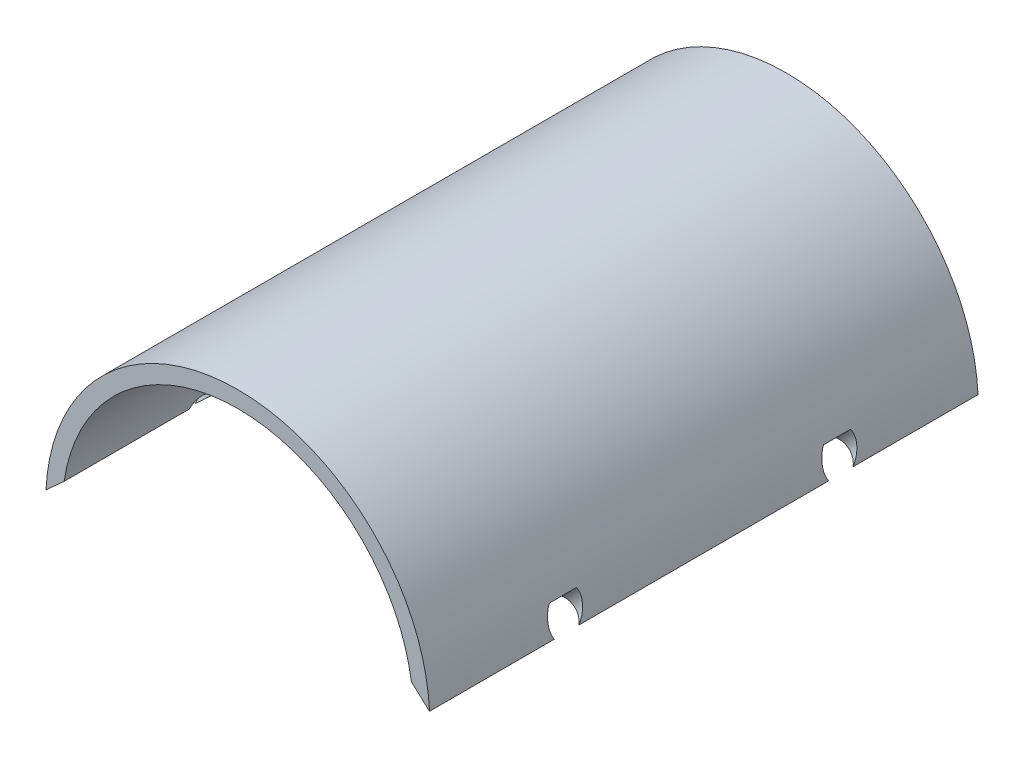
ISO-10303-21;
HEADER;
FILE_DESCRIPTION(('STEP AP214'),'2;1');
FILE_NAME('part.step','',(''),(''),'','','');
FILE_SCHEMA(('AUTOMOTIVE_DESIGN { 1 0 10303 214 1 1 1 1 }'));
ENDSEC;
DATA;
#1=APPLICATION_CONTEXT('core data for automotive mechanical design processes');
#2=APPLICATION_PROTOCOL_DEFINITION('international standard','automotive_design',2000,#1);
#3=PRODUCT_CONTEXT('',#1,'mechanical');
#4=PRODUCT('Part','Part','',(#3));
#5=PRODUCT_RELATED_PRODUCT_CATEGORY('part','',(#4));
#6=PRODUCT_DEFINITION_FORMATION('','',#4);
#7=PRODUCT_DEFINITION_CONTEXT('part definition',#1,'design');
#8=PRODUCT_DEFINITION('design','',#6,#7);
#9=PRODUCT_DEFINITION_SHAPE('','',#8);
#10=(LENGTH_UNIT() NAMED_UNIT(*) SI_UNIT(.MILLI.,.METRE.));
#11=(NAMED_UNIT(*) PLANE_ANGLE_UNIT() SI_UNIT($,.RADIAN.));
#12=(NAMED_UNIT(*) SI_UNIT($,.STERADIAN.) SOLID_ANGLE_UNIT());
#13=UNCERTAINTY_MEASURE_WITH_UNIT(LENGTH_MEASURE(1.E-05),#10,'distance_accuracy_value','');
#14=(GEOMETRIC_REPRESENTATION_CONTEXT(3) GLOBAL_UNCERTAINTY_ASSIGNED_CONTEXT((#13)) GLOBAL_UNIT_ASSIGNED_CONTEXT((#10,
#11,#12)) REPRESENTATION_CONTEXT('',''));
#15=CARTESIAN_POINT('',(0.,0.,0.));
#16=DIRECTION('',(0.,0.,1.));
#17=DIRECTION('',(1.,0.,0.));
#18=AXIS2_PLACEMENT_3D('',#15,#16,#17);
#19=CARTESIAN_POINT('',(40.2038837694651,5.93778829627168,127.));
#20=DIRECTION('',(0.672307408747507,0.740272077106257,0.));
#21=DIRECTION('',(-0.740272077106257,0.672307408747507,0.));
#22=AXIS2_PLACEMENT_3D('',#19,#20,#21);
#23=PLANE('',#22);
#24=DIRECTION('',(0.,0.,-1.));
#25=VECTOR('',#24,1.);
#26=CARTESIAN_POINT('',(40.2038837694651,5.93778829627168,127.));
#27=LINE('',#26,#25);
#28=CARTESIAN_POINT('',(40.2038837694651,5.93778829627169,92.4266801787406));
#29=VERTEX_POINT('',#28);
#30=CARTESIAN_POINT('',(40.2038837694651,5.93778829627169,34.5733198212594));
#31=VERTEX_POINT('',#30);
#32=EDGE_CURVE('E175',#29,#31,#27,.T.);
#33=ORIENTED_EDGE('',*,*,#32,.T.);
#34=CARTESIAN_POINT('',(42.3014633715025,4.03278829627168,31.75));
#35=DIRECTION('',(-0.672307408747507,-0.740272077106257,0.));
#36=DIRECTION('',(-0.740272077106257,0.672307408747507,0.));
#37=AXIS2_PLACEMENT_3D('',#34,#35,#36);
#38=CIRCLE('',#37,4.);
#39=CARTESIAN_POINT('',(44.39904297354,2.12778829627169,34.5733198212594));
#40=VERTEX_POINT('',#39);
#41=EDGE_CURVE('E157',#40,#31,#38,.T.);
#42=ORIENTED_EDGE('',*,*,#41,.F.);
#43=DIRECTION('',(0.,0.,-1.));
#44=VECTOR('',#43,1.);
#45=CARTESIAN_POINT('',(44.39904297354,2.12778829627168,127.));
#46=LINE('',#45,#44);
#47=CARTESIAN_POINT('',(44.39904297354,2.12778829627169,92.4266801787406));
#48=VERTEX_POINT('',#47);
#49=EDGE_CURVE('E180',#48,#40,#46,.T.);
#50=ORIENTED_EDGE('',*,*,#49,.F.);
#51=CARTESIAN_POINT('',(42.3014633715025,4.03278829627168,95.25));
#52=DIRECTION('',(-0.672307408747507,-0.740272077106257,0.));
#53=DIRECTION('',(0.740272077106257,-0.672307408747507,0.));
#54=AXIS2_PLACEMENT_3D('',#51,#52,#53);
#55=CIRCLE('',#54,4.);
#56=EDGE_CURVE('E162',#29,#48,#55,.T.);
#57=ORIENTED_EDGE('',*,*,#56,.F.);
#58=EDGE_LOOP('',(#33,#42,#50,#57));
#59=FACE_BOUND('',#58,.T.);
#60=ADVANCED_FACE('F34',(#59),#23,.F.);
#61=CARTESIAN_POINT('',(40.2038837694651,5.93778829627168,127.));
#62=VERTEX_POINT('',#61);
#63=CARTESIAN_POINT('',(40.2038837694651,5.93778829627169,98.0733198212594));
#64=VERTEX_POINT('',#63);
#65=EDGE_CURVE('E178',#62,#64,#27,.T.);
#66=ORIENTED_EDGE('',*,*,#65,.T.);
#67=CARTESIAN_POINT('',(44.39904297354,2.12778829627169,98.0733198212594));
#68=VERTEX_POINT('',#67);
#69=EDGE_CURVE('E240',#68,#64,#55,.T.);
#70=ORIENTED_EDGE('',*,*,#69,.F.);
#71=CARTESIAN_POINT('',(44.39904297354,2.12778829627168,127.));
#72=VERTEX_POINT('',#71);
#73=EDGE_CURVE('E176',#72,#68,#46,.T.);
#74=ORIENTED_EDGE('',*,*,#73,.F.);
#75=DIRECTION('',(0.740272077106257,-0.672307408747507,0.));
#76=VECTOR('',#75,1.);
#77=CARTESIAN_POINT('',(40.2038837694651,5.93778829627168,127.));
#78=LINE('',#77,#76);
#79=EDGE_CURVE('E305',#62,#72,#78,.T.);
#80=ORIENTED_EDGE('',*,*,#79,.F.);
#81=EDGE_LOOP('',(#66,#70,#74,#80));
#82=FACE_BOUND('',#81,.T.);
#83=ADVANCED_FACE('F352',(#82),#23,.F.);
#84=CARTESIAN_POINT('',(-40.2038837694651,5.93778829627168,127.));
#85=DIRECTION('',(-0.672307408747507,0.740272077106257,0.));
#86=DIRECTION('',(-0.740272077106257,-0.672307408747507,0.));
#87=AXIS2_PLACEMENT_3D('',#84,#85,#86);
#88=PLANE('',#87);
#89=DIRECTION('',(0.,0.,-1.));
#90=VECTOR('',#89,1.);
#91=CARTESIAN_POINT('',(-44.39904297354,2.12778829627168,127.));
#92=LINE('',#91,#90);
#93=CARTESIAN_POINT('',(-44.39904297354,2.12778829627168,92.4266801787406));
#94=VERTEX_POINT('',#93);
#95=CARTESIAN_POINT('',(-44.39904297354,2.12778829627168,34.5733198212594));
#96=VERTEX_POINT('',#95);
#97=EDGE_CURVE('E328',#94,#96,#92,.T.);
#98=ORIENTED_EDGE('',*,*,#97,.T.);
#99=CARTESIAN_POINT('',(-42.3014633715025,4.03278829627169,31.75));
#100=DIRECTION('',(-0.672307408747507,0.740272077106257,0.));
#101=DIRECTION('',(-0.740272077106257,-0.672307408747507,0.));
#102=AXIS2_PLACEMENT_3D('',#99,#100,#101);
#103=CIRCLE('',#102,4.);
#104=CARTESIAN_POINT('',(-40.2038837694651,5.93778829627168,34.5733198212594));
#105=VERTEX_POINT('',#104);
#106=EDGE_CURVE('E194',#96,#105,#103,.T.);
#107=ORIENTED_EDGE('',*,*,#106,.T.);
#108=DIRECTION('',(0.,0.,-1.));
#109=VECTOR('',#108,1.);
#110=CARTESIAN_POINT('',(-40.2038837694651,5.93778829627168,127.));
#111=LINE('',#110,#109);
#112=CARTESIAN_POINT('',(-40.2038837694651,5.93778829627168,92.4266801787406));
#113=VERTEX_POINT('',#112);
#114=EDGE_CURVE('E325',#113,#105,#111,.T.);
#115=ORIENTED_EDGE('',*,*,#114,.F.);
#116=CARTESIAN_POINT('',(-42.3014633715025,4.03278829627169,95.25));
#117=DIRECTION('',(-0.672307408747507,0.740272077106257,0.));
#118=DIRECTION('',(-0.740272077106257,-0.672307408747507,0.));
#119=AXIS2_PLACEMENT_3D('',#116,#117,#118);
#120=CIRCLE('',#119,4.);
#121=EDGE_CURVE('E184',#113,#94,#120,.T.);
#122=ORIENTED_EDGE('',*,*,#121,.T.);
#123=EDGE_LOOP('',(#98,#107,#115,#122));
#124=FACE_BOUND('',#123,.T.);
#125=ADVANCED_FACE('F357',(#124),#88,.F.);
#126=CARTESIAN_POINT('',(-44.39904297354,2.12778829627168,127.));
#127=VERTEX_POINT('',#126);
#128=CARTESIAN_POINT('',(-44.39904297354,2.12778829627168,98.0733198212594));
#129=VERTEX_POINT('',#128);
#130=EDGE_CURVE('E326',#127,#129,#92,.T.);
#131=ORIENTED_EDGE('',*,*,#130,.T.);
#132=CARTESIAN_POINT('',(-42.3014633715025,4.03278829627169,95.25));
#133=DIRECTION('',(0.672307408747507,-0.740272077106257,0.));
#134=DIRECTION('',(0.740272077106257,0.672307408747507,0.));
#135=AXIS2_PLACEMENT_3D('',#132,#133,#134);
#136=CIRCLE('',#135,4.);
#137=CARTESIAN_POINT('',(-40.2038837694651,5.93778829627168,98.0733198212595));
#138=VERTEX_POINT('',#137);
#139=EDGE_CURVE('E271',#138,#129,#136,.T.);
#140=ORIENTED_EDGE('',*,*,#139,.F.);
#141=CARTESIAN_POINT('',(-40.2038837694651,5.93778829627168,127.));
#142=VERTEX_POINT('',#141);
#143=EDGE_CURVE('E321',#142,#138,#111,.T.);
#144=ORIENTED_EDGE('',*,*,#143,.F.);
#145=DIRECTION('',(0.740272077106257,0.672307408747507,0.));
#146=VECTOR('',#145,1.);
#147=CARTESIAN_POINT('',(-40.2038837694651,5.93778829627168,127.));
#148=LINE('',#147,#146);
#149=EDGE_CURVE('E310',#127,#142,#148,.T.);
#150=ORIENTED_EDGE('',*,*,#149,.F.);
#151=EDGE_LOOP('',(#131,#140,#144,#150));
#152=FACE_BOUND('',#151,.T.);
#153=ADVANCED_FACE('F363',(#152),#88,.F.);
#154=CARTESIAN_POINT('',(0.,0.,127.));
#155=DIRECTION('',(0.,0.,-1.));
#156=DIRECTION('',(-1.,0.,0.));
#157=AXIS2_PLACEMENT_3D('',#154,#155,#156);
#158=CYLINDRICAL_SURFACE('',#157,40.64);
#159=CARTESIAN_POINT('',(40.2038837694651,5.93778829627169,28.9266801787406));
#160=VERTEX_POINT('',#159);
#161=CARTESIAN_POINT('',(40.2038837694651,5.93778829627168,0.));
#162=VERTEX_POINT('',#161);
#163=EDGE_CURVE('E168',#160,#162,#27,.T.);
#164=ORIENTED_EDGE('',*,*,#163,.F.);
#165=CARTESIAN_POINT('',(40.2038837694651,5.93778829627168,28.9266801787406));
#166=CARTESIAN_POINT('',(40.1913132421633,6.02291585990195,28.9934510123841));
#167=CARTESIAN_POINT('',(40.1788118055654,6.10567612462735,29.0633090284334));
#168=CARTESIAN_POINT('',(40.1541531544196,6.26578865022538,29.2091564919255));
#169=CARTESIAN_POINT('',(40.141996254572,6.34313605606762,29.2851513154342));
#170=CARTESIAN_POINT('',(40.1181724615959,6.49211688683357,29.4436650040298));
#171=CARTESIAN_POINT('',(40.1065096054522,6.56370640806694,29.5262259066478));
#172=CARTESIAN_POINT('',(40.084010278307,6.6997366130758,29.6971383550985));
#173=CARTESIAN_POINT('',(40.0731736749685,6.76417844241918,29.785488969387));
#174=CARTESIAN_POINT('',(40.0525137129598,6.88545967671023,29.9681581372088));
#175=CARTESIAN_POINT('',(40.0426967734591,6.94225151658456,30.0625091010737));
#176=CARTESIAN_POINT('',(40.0244097045485,7.04691787405929,30.2561039358884));
#177=CARTESIAN_POINT('',(40.0159388212325,7.09479738591596,30.3553450268524));
#178=CARTESIAN_POINT('',(40.0005991194072,7.18077811889623,30.5577622636442));
#179=CARTESIAN_POINT('',(39.9937256904317,7.21890751291721,30.6609260593821));
#180=CARTESIAN_POINT('',(39.9817585070471,7.28489638060096,30.8705846116719));
#181=CARTESIAN_POINT('',(39.9766644580635,7.31275755419961,30.9770788136948));
#182=CARTESIAN_POINT('',(39.9688951209998,7.35509542875868,31.1799319276882));
#183=CARTESIAN_POINT('',(39.9660082465001,7.3707473426962,31.276038760085));
#184=CARTESIAN_POINT('',(39.9618273423075,7.3933814191251,31.4692982070598));
#185=CARTESIAN_POINT('',(39.9605331676218,7.40036437080397,31.5664507256303));
#186=CARTESIAN_POINT('',(39.959572741404,7.40554902528819,31.7610426896164));
#187=CARTESIAN_POINT('',(39.9599071437956,7.40374720073629,31.8584822345852));
#188=CARTESIAN_POINT('',(39.9621931505267,7.39139675083091,32.0527577855384));
#189=CARTESIAN_POINT('',(39.9641446988048,7.38084842869078,32.1495938123277));
#190=CARTESIAN_POINT('',(39.9719414920248,7.33855241593986,32.4233064206819));
#191=CARTESIAN_POINT('',(39.9796837595757,7.29642130763877,32.598631266668));
#192=CARTESIAN_POINT('',(39.999871326816,7.18491731329964,32.9398936292307));
#193=CARTESIAN_POINT('',(40.0123158095611,7.11554915923651,33.1058327706885));
#194=CARTESIAN_POINT('',(40.0415424936381,6.94923599022483,33.4318167729333));
#195=CARTESIAN_POINT('',(40.0584870977926,6.85124076692095,33.5913081757797));
#196=CARTESIAN_POINT('',(40.095192960951,6.63304538763829,33.8939532611374));
#197=CARTESIAN_POINT('',(40.1149555090133,6.51283506194857,34.0370994123058));
#198=CARTESIAN_POINT('',(40.1465702815048,6.31406979300912,34.2436060183779));
#199=CARTESIAN_POINT('',(40.1578673895727,6.24187114155977,34.3133169061829));
#200=CARTESIAN_POINT('',(40.1807169493678,6.09304946759938,34.4473146031002));
#201=CARTESIAN_POINT('',(40.1922684964993,6.01644092130683,34.5116176253914));
#202=CARTESIAN_POINT('',(40.2038837694651,5.93778829627168,34.5733198212594));
#203=B_SPLINE_CURVE_WITH_KNOTS('',3,(#165,#166,#167,#168,#169,#170,#171,#172,#173,#174,#175,
#176,#177,#178,#179,#180,#181,#182,#183,#184,#185,#186,#187,#188,#189,#190,#191,#192,#193,#194,
#195,#196,#197,#198,#199,#200,#201,#202),.UNSPECIFIED.,.F.,.F.,(4,2,2,2,2,2,2,2,2,2,2,2,2,2,2,2,
2,2,4),(0.,0.326735220214416,0.653759843865196,0.983079210473243,1.312345720231,
1.64357330309618,1.97461471142325,2.30468848457325,2.63470758840894,2.92656284759354,
3.21839153549946,3.51033741122766,3.80227316654105,4.34104349743152,4.87972026749841,
5.44137750791957,6.00329250565085,6.30606558674252,6.60789591837455),.UNSPECIFIED.);
#204=EDGE_CURVE('E152',#160,#31,#203,.T.);
#205=ORIENTED_EDGE('',*,*,#204,.T.);
#206=ORIENTED_EDGE('',*,*,#32,.F.);
#207=CARTESIAN_POINT('',(40.2038837694651,5.93778829627168,92.4266801787406));
#208=CARTESIAN_POINT('',(40.1913132421633,6.02291585990195,92.4934510123841));
#209=CARTESIAN_POINT('',(40.1788118055654,6.10567612462735,92.5633090284335));
#210=CARTESIAN_POINT('',(40.1541531544196,6.26578865022538,92.7091564919255));
#211=CARTESIAN_POINT('',(40.141996254572,6.34313605606763,92.7851513154342));
#212=CARTESIAN_POINT('',(40.1181724615959,6.49211688683358,92.9436650040298));
#213=CARTESIAN_POINT('',(40.1065096054522,6.56370640806695,93.0262259066478));
#214=CARTESIAN_POINT('',(40.084010278307,6.69973661307581,93.1971383550985));
#215=CARTESIAN_POINT('',(40.0731736749685,6.76417844241919,93.285488969387));
#216=CARTESIAN_POINT('',(40.0525137129598,6.88545967671023,93.4681581372088));
#217=CARTESIAN_POINT('',(40.0426967734591,6.94225151658455,93.5625091010737));
#218=CARTESIAN_POINT('',(40.0244097045485,7.04691787405928,93.7561039358884));
#219=CARTESIAN_POINT('',(40.0159388212325,7.09479738591596,93.8553450268524));
#220=CARTESIAN_POINT('',(40.0005991194072,7.18077811889623,94.0577622636442));
#221=CARTESIAN_POINT('',(39.9937256904317,7.21890751291721,94.1609260593821));
#222=CARTESIAN_POINT('',(39.9817585070471,7.28489638060096,94.3705846116719));
#223=CARTESIAN_POINT('',(39.9766644580635,7.31275755419962,94.4770788136948));
#224=CARTESIAN_POINT('',(39.9688951209998,7.35509542875869,94.6799319276882));
#225=CARTESIAN_POINT('',(39.9660082465001,7.3707473426962,94.776038760085));
#226=CARTESIAN_POINT('',(39.9618273423075,7.3933814191251,94.9692982070598));
#227=CARTESIAN_POINT('',(39.9605331676218,7.40036437080397,95.0664507256303));
#228=CARTESIAN_POINT('',(39.959572741404,7.40554902528819,95.2610426896164));
#229=CARTESIAN_POINT('',(39.9599071437956,7.40374720073628,95.3584822345853));
#230=CARTESIAN_POINT('',(39.9621931505267,7.39139675083091,95.5527577855385));
#231=CARTESIAN_POINT('',(39.9641446988048,7.38084842869077,95.6495938123277));
#232=CARTESIAN_POINT('',(39.9719414920248,7.33855241593986,95.9233064206819));
#233=CARTESIAN_POINT('',(39.9796837595757,7.29642130763877,96.098631266668));
#234=CARTESIAN_POINT('',(39.999871326816,7.18491731329964,96.4398936292307));
#235=CARTESIAN_POINT('',(40.0123158095611,7.11554915923652,96.6058327706885));
#236=CARTESIAN_POINT('',(40.0415424936381,6.94923599022484,96.9318167729333));
#237=CARTESIAN_POINT('',(40.0584870977926,6.85124076692094,97.0913081757797));
#238=CARTESIAN_POINT('',(40.095192960951,6.63304538763829,97.3939532611374));
#239=CARTESIAN_POINT('',(40.1149555090133,6.51283506194857,97.5370994123058));
#240=CARTESIAN_POINT('',(40.1465702815048,6.31406979300912,97.7436060183779));
#241=CARTESIAN_POINT('',(40.1578673895727,6.24187114155977,97.8133169061829));
#242=CARTESIAN_POINT('',(40.1807169493678,6.09304946759938,97.9473146031002));
#243=CARTESIAN_POINT('',(40.1922684964993,6.01644092130682,98.0116176253914));
#244=CARTESIAN_POINT('',(40.2038837694651,5.93778829627168,98.0733198212594));
#245=B_SPLINE_CURVE_WITH_KNOTS('',3,(#207,#208,#209,#210,#211,#212,#213,#214,#215,#216,#217,
#218,#219,#220,#221,#222,#223,#224,#225,#226,#227,#228,#229,#230,#231,#232,#233,#234,#235,#236,
#237,#238,#239,#240,#241,#242,#243,#244),.UNSPECIFIED.,.F.,.F.,(4,2,2,2,2,2,2,2,2,2,2,2,2,2,2,2,
2,2,4),(0.,0.326735220214427,0.653759843865201,0.983079210473244,1.312345720231,
1.64357330309617,1.97461471142324,2.30468848457325,2.63470758840894,2.92656284759356,
3.21839153549947,3.51033741122768,3.80227316654105,4.34104349743151,4.8797202674984,
5.44137750791957,6.00329250565085,6.30606558674251,6.60789591837454),.UNSPECIFIED.);
#246=EDGE_CURVE('E232',#29,#64,#245,.T.);
#247=ORIENTED_EDGE('',*,*,#246,.T.);
#248=ORIENTED_EDGE('',*,*,#65,.F.);
#249=CARTESIAN_POINT('',(0.,0.,127.));
#250=DIRECTION('',(0.,0.,-1.));
#251=DIRECTION('',(1.,0.,0.));
#252=AXIS2_PLACEMENT_3D('',#249,#250,#251);
#253=CIRCLE('',#252,40.64);
#254=EDGE_CURVE('E302',#142,#62,#253,.T.);
#255=ORIENTED_EDGE('',*,*,#254,.F.);
#256=ORIENTED_EDGE('',*,*,#143,.T.);
#257=CARTESIAN_POINT('',(-40.2038837694651,5.93778829627168,98.0733198212594));
#258=CARTESIAN_POINT('',(-40.1913132421633,6.02291585990196,98.0065489876159));
#259=CARTESIAN_POINT('',(-40.1788118055654,6.10567612462736,97.9366909715666));
#260=CARTESIAN_POINT('',(-40.1541531544196,6.26578865022539,97.7908435080745));
#261=CARTESIAN_POINT('',(-40.141996254572,6.34313605606764,97.7148486845658));
#262=CARTESIAN_POINT('',(-40.1181724615959,6.49211688683358,97.5563349959702));
#263=CARTESIAN_POINT('',(-40.1065096054522,6.56370640806695,97.4737740933522));
#264=CARTESIAN_POINT('',(-40.084010278307,6.69973661307581,97.3028616449015));
#265=CARTESIAN_POINT('',(-40.0731736749685,6.76417844241919,97.2145110306131));
#266=CARTESIAN_POINT('',(-40.0525137129598,6.88545967671023,97.0318418627912));
#267=CARTESIAN_POINT('',(-40.0426967734591,6.94225151658456,96.9374908989263));
#268=CARTESIAN_POINT('',(-40.0244097045485,7.04691787405929,96.7438960641116));
#269=CARTESIAN_POINT('',(-40.0159388212325,7.09479738591597,96.6446549731476));
#270=CARTESIAN_POINT('',(-40.0005991194072,7.18077811889623,96.4422377363558));
#271=CARTESIAN_POINT('',(-39.9937256904317,7.21890751291721,96.3390739406179));
#272=CARTESIAN_POINT('',(-39.9817585070471,7.28489638060096,96.1294153883281));
#273=CARTESIAN_POINT('',(-39.9766644580635,7.31275755419962,96.0229211863052));
#274=CARTESIAN_POINT('',(-39.9688951209998,7.35509542875869,95.8200680723119));
#275=CARTESIAN_POINT('',(-39.9660082465001,7.3707473426962,95.723961239915));
#276=CARTESIAN_POINT('',(-39.9618273423075,7.39338141912511,95.5307017929402));
#277=CARTESIAN_POINT('',(-39.9605331676218,7.40036437080398,95.4335492743697));
#278=CARTESIAN_POINT('',(-39.959572741404,7.4055490252882,95.2389573103836));
#279=CARTESIAN_POINT('',(-39.9599071437956,7.40374720073629,95.1415177654148));
#280=CARTESIAN_POINT('',(-39.9621931505267,7.39139675083092,94.9472422144616));
#281=CARTESIAN_POINT('',(-39.9641446988048,7.38084842869079,94.8504061876723));
#282=CARTESIAN_POINT('',(-39.9719414920248,7.33855241593987,94.5766935793181));
#283=CARTESIAN_POINT('',(-39.9796837595757,7.29642130763877,94.401368733332));
#284=CARTESIAN_POINT('',(-39.999871326816,7.18491731329965,94.0601063707693));
#285=CARTESIAN_POINT('',(-40.0123158095611,7.11554915923653,93.8941672293115));
#286=CARTESIAN_POINT('',(-40.0415424936381,6.94923599022485,93.5681832270667));
#287=CARTESIAN_POINT('',(-40.0584870977926,6.85124076692096,93.4086918242203));
#288=CARTESIAN_POINT('',(-40.095192960951,6.63304538763831,93.1060467388627));
#289=CARTESIAN_POINT('',(-40.1149555090133,6.51283506194859,92.9629005876942));
#290=CARTESIAN_POINT('',(-40.1465702815048,6.31406979300914,92.7563939816221));
#291=CARTESIAN_POINT('',(-40.1578673895727,6.24187114155978,92.6866830938171));
#292=CARTESIAN_POINT('',(-40.1807169493678,6.09304946759939,92.5526853968998));
#293=CARTESIAN_POINT('',(-40.1922684964993,6.01644092130683,92.4883823746086));
#294=CARTESIAN_POINT('',(-40.2038837694651,5.93778829627169,92.4266801787406));
#295=B_SPLINE_CURVE_WITH_KNOTS('',3,(#257,#258,#259,#260,#261,#262,#263,#264,#265,#266,#267,
#268,#269,#270,#271,#272,#273,#274,#275,#276,#277,#278,#279,#280,#281,#282,#283,#284,#285,#286,
#287,#288,#289,#290,#291,#292,#293,#294),.UNSPECIFIED.,.F.,.F.,(4,2,2,2,2,2,2,2,2,2,2,2,2,2,2,2,
2,2,4),(0.,0.326735220214419,0.6537598438652,0.983079210473239,1.31234572023098,
1.64357330309617,1.97461471142325,2.30468848457322,2.63470758840893,2.9265628475935,
3.21839153549944,3.51033741122763,3.80227316654104,4.34104349743151,4.87972026749839,
5.44137750791955,6.00329250565083,6.30606558674251,6.60789591837454),.UNSPECIFIED.);
#296=EDGE_CURVE('E296',#138,#113,#295,.T.);
#297=ORIENTED_EDGE('',*,*,#296,.T.);
#298=ORIENTED_EDGE('',*,*,#114,.T.);
#299=CARTESIAN_POINT('',(-40.2038837694651,5.93778829627168,34.5733198212594));
#300=CARTESIAN_POINT('',(-40.1913132421633,6.02291585990195,34.5065489876159));
#301=CARTESIAN_POINT('',(-40.1788118055654,6.10567612462735,34.4366909715666));
#302=CARTESIAN_POINT('',(-40.1541531544196,6.26578865022539,34.2908435080745));
#303=CARTESIAN_POINT('',(-40.141996254572,6.34313605606763,34.2148486845658));
#304=CARTESIAN_POINT('',(-40.1181724615959,6.49211688683358,34.0563349959702));
#305=CARTESIAN_POINT('',(-40.1065096054522,6.56370640806695,33.9737740933522));
#306=CARTESIAN_POINT('',(-40.084010278307,6.69973661307581,33.8028616449015));
#307=CARTESIAN_POINT('',(-40.0731736749685,6.76417844241919,33.714511030613));
#308=CARTESIAN_POINT('',(-40.0525137129598,6.88545967671023,33.5318418627912));
#309=CARTESIAN_POINT('',(-40.0426967734591,6.94225151658456,33.4374908989263));
#310=CARTESIAN_POINT('',(-40.0244097045485,7.04691787405929,33.2438960641116));
#311=CARTESIAN_POINT('',(-40.0159388212325,7.09479738591597,33.1446549731476));
#312=CARTESIAN_POINT('',(-40.0005991194072,7.18077811889623,32.9422377363558));
#313=CARTESIAN_POINT('',(-39.9937256904317,7.21890751291721,32.8390739406179));
#314=CARTESIAN_POINT('',(-39.9817585070471,7.28489638060096,32.6294153883281));
#315=CARTESIAN_POINT('',(-39.9766644580635,7.31275755419962,32.5229211863052));
#316=CARTESIAN_POINT('',(-39.9688951209998,7.35509542875869,32.3200680723118));
#317=CARTESIAN_POINT('',(-39.9660082465001,7.37074734269621,32.223961239915));
#318=CARTESIAN_POINT('',(-39.9618273423075,7.39338141912511,32.0307017929402));
#319=CARTESIAN_POINT('',(-39.9605331676218,7.40036437080398,31.9335492743697));
#320=CARTESIAN_POINT('',(-39.959572741404,7.4055490252882,31.7389573103836));
#321=CARTESIAN_POINT('',(-39.9599071437956,7.40374720073629,31.6415177654148));
#322=CARTESIAN_POINT('',(-39.9621931505267,7.39139675083092,31.4472422144616));
#323=CARTESIAN_POINT('',(-39.9641446988048,7.38084842869078,31.3504061876723));
#324=CARTESIAN_POINT('',(-39.9719414920248,7.33855241593987,31.0766935793181));
#325=CARTESIAN_POINT('',(-39.9796837595757,7.29642130763878,30.901368733332));
#326=CARTESIAN_POINT('',(-39.999871326816,7.18491731329965,30.5601063707693));
#327=CARTESIAN_POINT('',(-40.0123158095611,7.11554915923652,30.3941672293115));
#328=CARTESIAN_POINT('',(-40.0415424936381,6.94923599022484,30.0681832270667));
#329=CARTESIAN_POINT('',(-40.0584870977926,6.85124076692095,29.9086918242203));
#330=CARTESIAN_POINT('',(-40.095192960951,6.6330453876383,29.6060467388626));
#331=CARTESIAN_POINT('',(-40.1149555090133,6.51283506194858,29.4629005876942));
#332=CARTESIAN_POINT('',(-40.1465702815048,6.31406979300913,29.2563939816221));
#333=CARTESIAN_POINT('',(-40.1578673895727,6.24187114155977,29.1866830938171));
#334=CARTESIAN_POINT('',(-40.1807169493678,6.09304946759938,29.0526853968998));
#335=CARTESIAN_POINT('',(-40.1922684964993,6.01644092130683,28.9883823746086));
#336=CARTESIAN_POINT('',(-40.2038837694651,5.93778829627168,28.9266801787406));
#337=B_SPLINE_CURVE_WITH_KNOTS('',3,(#299,#300,#301,#302,#303,#304,#305,#306,#307,#308,#309,
#310,#311,#312,#313,#314,#315,#316,#317,#318,#319,#320,#321,#322,#323,#324,#325,#326,#327,#328,
#329,#330,#331,#332,#333,#334,#335,#336),.UNSPECIFIED.,.F.,.F.,(4,2,2,2,2,2,2,2,2,2,2,2,2,2,2,2,
2,2,4),(0.,0.326735220214417,0.653759843865196,0.983079210473245,1.31234572023099,
1.64357330309618,1.97461471142326,2.30468848457325,2.63470758840894,2.92656284759354,
3.21839153549946,3.51033741122766,3.80227316654105,4.34104349743152,4.87972026749841,
5.44137750791957,6.00329250565085,6.30606558674253,6.60789591837456),.UNSPECIFIED.);
#338=CARTESIAN_POINT('',(-40.2038837694651,5.93778829627168,28.9266801787406));
#339=VERTEX_POINT('',#338);
#340=EDGE_CURVE('E265',#105,#339,#337,.T.);
#341=ORIENTED_EDGE('',*,*,#340,.T.);
#342=CARTESIAN_POINT('',(-40.2038837694651,5.93778829627168,0.));
#343=VERTEX_POINT('',#342);
#344=EDGE_CURVE('E312',#339,#343,#111,.T.);
#345=ORIENTED_EDGE('',*,*,#344,.T.);
#346=CARTESIAN_POINT('',(0.,0.,0.));
#347=DIRECTION('',(0.,0.,-1.));
#348=DIRECTION('',(1.,0.,0.));
#349=AXIS2_PLACEMENT_3D('',#346,#347,#348);
#350=CIRCLE('',#349,40.64);
#351=EDGE_CURVE('E174',#343,#162,#350,.T.);
#352=ORIENTED_EDGE('',*,*,#351,.T.);
#353=EDGE_LOOP('',(#164,#205,#206,#247,#248,#255,#256,#297,#298,#341,#345,#352));
#354=FACE_BOUND('',#353,.T.);
#355=ADVANCED_FACE('F36',(#354),#158,.F.);
#356=CARTESIAN_POINT('',(44.39904297354,2.12778829627169,28.9266801787406));
#357=VERTEX_POINT('',#356);
#358=CARTESIAN_POINT('',(44.39904297354,2.12778829627168,0.));
#359=VERTEX_POINT('',#358);
#360=EDGE_CURVE('E170',#357,#359,#46,.T.);
#361=ORIENTED_EDGE('',*,*,#360,.F.);
#362=EDGE_CURVE('E155',#160,#357,#38,.T.);
#363=ORIENTED_EDGE('',*,*,#362,.F.);
#364=ORIENTED_EDGE('',*,*,#163,.T.);
#365=DIRECTION('',(0.740272077106257,-0.672307408747507,0.));
#366=VECTOR('',#365,1.);
#367=CARTESIAN_POINT('',(40.2038837694651,5.93778829627168,0.));
#368=LINE('',#367,#366);
#369=EDGE_CURVE('E314',#162,#359,#368,.T.);
#370=ORIENTED_EDGE('',*,*,#369,.T.);
#371=EDGE_LOOP('',(#361,#363,#364,#370));
#372=FACE_BOUND('',#371,.T.);
#373=ADVANCED_FACE('F166',(#372),#23,.F.);
#374=CARTESIAN_POINT('',(0.,0.,127.));
#375=DIRECTION('',(0.,0.,-1.));
#376=DIRECTION('',(-1.,0.,0.));
#377=AXIS2_PLACEMENT_3D('',#374,#375,#376);
#378=CYLINDRICAL_SURFACE('',#377,44.45);
#379=DIRECTION('',(0.,0.,-1.));
#380=VECTOR('',#379,1.);
#381=CARTESIAN_POINT('',(43.5164083570557,9.06226813231524,127.));
#382=LINE('',#381,#380);
#383=CARTESIAN_POINT('',(43.5164083570557,9.06226813231524,34.8868521260829));
#384=VERTEX_POINT('',#383);
#385=CARTESIAN_POINT('',(43.5164083570557,9.06226813231524,28.6131478739171));
#386=VERTEX_POINT('',#385);
#387=EDGE_CURVE('E498',#384,#386,#382,.T.);
#388=ORIENTED_EDGE('',*,*,#387,.T.);
#389=CARTESIAN_POINT('',(43.5164083570557,9.06226813231525,28.6131478739171));
#390=CARTESIAN_POINT('',(43.5459474701339,8.92048498286616,28.5204306563017));
#391=CARTESIAN_POINT('',(43.5757646558694,8.77377513570434,28.435590560697));
#392=CARTESIAN_POINT('',(43.6353058073171,8.47265027961244,28.2814390201634));
#393=CARTESIAN_POINT('',(43.665029845536,8.31824678619599,28.2121051720918));
#394=CARTESIAN_POINT('',(43.7235728763072,8.004807918845,28.0890025406013));
#395=CARTESIAN_POINT('',(43.7523974414843,7.84582357038326,28.0351054763365));
#396=CARTESIAN_POINT('',(43.808972381486,7.52351326464309,27.9416064918818));
#397=CARTESIAN_POINT('',(43.8367224183005,7.3601859680378,27.90200903777));
#398=CARTESIAN_POINT('',(43.9117680520718,6.90266594376116,27.8112678754889));
#399=CARTESIAN_POINT('',(43.9575367723057,6.60518911240005,27.774974582643));
#400=CARTESIAN_POINT('',(44.0433393956868,6.00654332404116,27.7433393846041));
#401=CARTESIAN_POINT('',(44.0833565412329,5.70536624689823,27.7481147713234));
#402=CARTESIAN_POINT('',(44.1424363719381,5.2231881803305,27.787280004765));
#403=CARTESIAN_POINT('',(44.1635654735733,5.04134195899998,27.8093318635527));
#404=CARTESIAN_POINT('',(44.2033578843568,4.6796073896138,27.8676556613698));
#405=CARTESIAN_POINT('',(44.2220206987796,4.49971944099915,27.9039304476797));
#406=CARTESIAN_POINT('',(44.2568190551056,4.14348111897403,27.9904671207472));
#407=CARTESIAN_POINT('',(44.2729596919251,3.96712425815466,28.0407002251195));
#408=CARTESIAN_POINT('',(44.3027906094189,3.61881395377028,28.1551917931019));
#409=CARTESIAN_POINT('',(44.3164808231753,3.44686063057022,28.2194506396312));
#410=CARTESIAN_POINT('',(44.3439145025844,3.07581965029034,28.3760843323733));
#411=CARTESIAN_POINT('',(44.3571514097291,2.87795195328541,28.4714962250809));
#412=CARTESIAN_POINT('',(44.3746035978478,2.58966519952048,28.6302281890801));
#413=CARTESIAN_POINT('',(44.3800213639429,2.49496946296753,28.6857547043138));
#414=CARTESIAN_POINT('',(44.3900952254232,2.30882078360496,28.8021686491463));
#415=CARTESIAN_POINT('',(44.3947508942505,2.21736967914249,28.8630590518706));
#416=CARTESIAN_POINT('',(44.39904297354,2.12778829627168,28.9266801787406));
#417=B_SPLINE_CURVE_WITH_KNOTS('',3,(#389,#390,#391,#392,#393,#394,#395,#396,#397,#398,#399,
#400,#401,#402,#403,#404,#405,#406,#407,#408,#409,#410,#411,#412,#413,#414,#415,#416),
.UNSPECIFIED.,.F.,.F.,(4,2,2,2,2,2,2,2,2,2,2,2,2,4),(0.,0.515441476372163,1.03013337110252,
1.54041505586037,2.0508559750974,2.95704776796264,3.86582849695968,4.41849482725667,
4.9712718520782,5.52291738958265,6.07457798953953,6.73343312484518,7.06300127399253,
7.39275326147906),.UNSPECIFIED.);
#418=EDGE_CURVE('E11',#386,#357,#417,.T.);
#419=ORIENTED_EDGE('',*,*,#418,.T.);
#420=ORIENTED_EDGE('',*,*,#360,.T.);
#421=CARTESIAN_POINT('',(0.,0.,0.));
#422=DIRECTION('',(0.,0.,1.));
#423=DIRECTION('',(1.,0.,0.));
#424=AXIS2_PLACEMENT_3D('',#421,#422,#423);
#425=CIRCLE('',#424,44.45);
#426=CARTESIAN_POINT('',(-44.39904297354,2.12778829627168,0.));
#427=VERTEX_POINT('',#426);
#428=EDGE_CURVE('E316',#359,#427,#425,.T.);
#429=ORIENTED_EDGE('',*,*,#428,.T.);
#430=CARTESIAN_POINT('',(-44.39904297354,2.12778829627168,28.9266801787406));
#431=VERTEX_POINT('',#430);
#432=EDGE_CURVE('E324',#431,#427,#92,.T.);
#433=ORIENTED_EDGE('',*,*,#432,.F.);
#434=CARTESIAN_POINT('',(-44.39904297354,2.12778829627169,28.9266801787406));
#435=CARTESIAN_POINT('',(-44.3923544121857,2.26755422855096,28.8274648839044));
#436=CARTESIAN_POINT('',(-44.3847697444573,2.41182904743819,28.7348491723727));
#437=CARTESIAN_POINT('',(-44.3676992322139,2.70766808373903,28.5625195523055));
#438=CARTESIAN_POINT('',(-44.3582146804163,2.85922729170751,28.4827969373645));
#439=CARTESIAN_POINT('',(-44.3374132457908,3.16535500446613,28.3371290720843));
#440=CARTESIAN_POINT('',(-44.3261319375629,3.31982210178386,28.2709640758075));
#441=CARTESIAN_POINT('',(-44.3015526560469,3.63312860846836,28.1504645585049));
#442=CARTESIAN_POINT('',(-44.2882547656636,3.79196783787064,28.096129551354));
#443=CARTESIAN_POINT('',(-44.258059245395,4.13018844143037,27.993989540617));
#444=CARTESIAN_POINT('',(-44.2409286505058,4.30994855252609,27.947506303486));
#445=CARTESIAN_POINT('',(-44.2039449863492,4.67416719068072,27.8685821480094));
#446=CARTESIAN_POINT('',(-44.184066246256,4.85865479889099,27.8362873030421));
#447=CARTESIAN_POINT('',(-44.1628902552898,5.0439691017319,27.8113957630929));
#448=B_SPLINE_CURVE_WITH_KNOTS('',3,(#434,#435,#436,#437,#438,#439,#440,#441,#442,#443,#444,
#445,#446,#447),.UNSPECIFIED.,.F.,.F.,(4,2,2,2,2,2,4),(0.,0.514248289297657,1.02814785559117,
1.53291089918042,2.03765319683236,2.59643000698799,3.16083196864484),.UNSPECIFIED.);
#449=CARTESIAN_POINT('',(-44.1628902552898,5.0439691017319,27.8113957630929));
#450=VERTEX_POINT('',#449);
#451=EDGE_CURVE('E245',#431,#450,#448,.T.);
#452=ORIENTED_EDGE('',*,*,#451,.T.);
#453=DIRECTION('',(0.,0.,-1.));
#454=VECTOR('',#453,1.);
#455=CARTESIAN_POINT('',(-44.1628902552898,5.0439691017319,127.));
#456=LINE('',#455,#454);
#457=CARTESIAN_POINT('',(-44.1628902552898,5.0439691017319,35.6886042369071));
#458=VERTEX_POINT('',#457);
#459=EDGE_CURVE('E199',#450,#458,#456,.F.);
#460=ORIENTED_EDGE('',*,*,#459,.T.);
#461=CARTESIAN_POINT('',(-44.1628902552898,5.0439691017319,35.6886042369071));
#462=CARTESIAN_POINT('',(-44.1820882207202,4.87594230518134,35.6660410497049));
#463=CARTESIAN_POINT('',(-44.2002218425883,4.70860522803788,35.637385663469));
#464=CARTESIAN_POINT('',(-44.2343731536034,4.37612964124249,35.5679341990871));
#465=CARTESIAN_POINT('',(-44.2503893669069,4.21099273646199,35.527129716719));
#466=CARTESIAN_POINT('',(-44.2800115624876,3.8870390773206,35.4343337320402));
#467=CARTESIAN_POINT('',(-44.2936571173332,3.7281618752831,35.3825664120567));
#468=CARTESIAN_POINT('',(-44.3189313479414,3.41460828009222,35.2673699251293));
#469=CARTESIAN_POINT('',(-44.330560895291,3.25993009608055,35.2039458223566));
#470=CARTESIAN_POINT('',(-44.3531677738895,2.93737590671438,35.0568156910253));
#471=CARTESIAN_POINT('',(-44.363895738379,2.77016886967959,34.9715838852114));
#472=CARTESIAN_POINT('',(-44.3783028882209,2.52498528170085,34.8317838004631));
#473=CARTESIAN_POINT('',(-44.3828439396484,2.44378091214643,34.7829008381602));
#474=CARTESIAN_POINT('',(-44.3913614431513,2.28384625817869,34.6811311513064));
#475=CARTESIAN_POINT('',(-44.3953376652043,2.20511699183729,34.6282428089611));
#476=CARTESIAN_POINT('',(-44.39904297354,2.12778829627169,34.5733198212594));
#477=B_SPLINE_CURVE_WITH_KNOTS('',3,(#461,#462,#463,#464,#465,#466,#467,#468,#469,#470,#471,
#472,#473,#474,#475,#476),.UNSPECIFIED.,.F.,.F.,(4,2,2,2,2,2,2,4),(0.,0.511752184475261,
1.02385920285529,1.52636097799274,2.02864496014022,2.59173143963582,2.87630157654165,
3.16098727221963),.UNSPECIFIED.);
#478=EDGE_CURVE('E252',#458,#96,#477,.T.);
#479=ORIENTED_EDGE('',*,*,#478,.T.);
#480=ORIENTED_EDGE('',*,*,#97,.F.);
#481=CARTESIAN_POINT('',(-44.39904297354,2.12778829627169,92.4266801787406));
#482=CARTESIAN_POINT('',(-44.3923544121857,2.26755422855095,92.3274648839044));
#483=CARTESIAN_POINT('',(-44.3847697444573,2.41182904743819,92.2348491723727));
#484=CARTESIAN_POINT('',(-44.3676992322139,2.70766808373903,92.0625195523055));
#485=CARTESIAN_POINT('',(-44.3582146804163,2.85922729170751,91.9827969373645));
#486=CARTESIAN_POINT('',(-44.3374132457908,3.16535500446613,91.8371290720843));
#487=CARTESIAN_POINT('',(-44.3261319375629,3.31982210178386,91.7709640758075));
#488=CARTESIAN_POINT('',(-44.3015526560469,3.63312860846835,91.6504645585049));
#489=CARTESIAN_POINT('',(-44.2882547656636,3.79196783787063,91.596129551354));
#490=CARTESIAN_POINT('',(-44.258059245395,4.13018844143037,91.493989540617));
#491=CARTESIAN_POINT('',(-44.2409286505058,4.30994855252608,91.447506303486));
#492=CARTESIAN_POINT('',(-44.2039449863492,4.67416719068071,91.3685821480094));
#493=CARTESIAN_POINT('',(-44.1840662462561,4.85865479889099,91.3362873030421));
#494=CARTESIAN_POINT('',(-44.1628902552898,5.0439691017319,91.3113957630929));
#495=B_SPLINE_CURVE_WITH_KNOTS('',3,(#481,#482,#483,#484,#485,#486,#487,#488,#489,#490,#491,
#492,#493,#494),.UNSPECIFIED.,.F.,.F.,(4,2,2,2,2,2,4),(0.,0.514248289297655,1.02814785559117,
1.53291089918042,2.03765319683236,2.59643000698798,3.16083196864484),.UNSPECIFIED.);
#496=CARTESIAN_POINT('',(-44.1628902552898,5.0439691017319,91.3113957630929));
#497=VERTEX_POINT('',#496);
#498=EDGE_CURVE('E275',#94,#497,#495,.T.);
#499=ORIENTED_EDGE('',*,*,#498,.T.);
#500=DIRECTION('',(0.,0.,-1.));
#501=VECTOR('',#500,1.);
#502=CARTESIAN_POINT('',(-44.1628902552898,5.0439691017319,127.));
#503=LINE('',#502,#501);
#504=CARTESIAN_POINT('',(-44.1628902552898,5.0439691017319,99.1886042369071));
#505=VERTEX_POINT('',#504);
#506=EDGE_CURVE('E189',#505,#497,#503,.T.);
#507=ORIENTED_EDGE('',*,*,#506,.F.);
#508=CARTESIAN_POINT('',(-44.1628902552898,5.0439691017319,99.1886042369071));
#509=CARTESIAN_POINT('',(-44.1820882207202,4.87594230518133,99.1660410497049));
#510=CARTESIAN_POINT('',(-44.2002218425883,4.70860522803788,99.137385663469));
#511=CARTESIAN_POINT('',(-44.2343731536034,4.37612964124249,99.0679341990871));
#512=CARTESIAN_POINT('',(-44.2503893669069,4.21099273646199,99.027129716719));
#513=CARTESIAN_POINT('',(-44.2800115624876,3.8870390773206,98.9343337320402));
#514=CARTESIAN_POINT('',(-44.2936571173332,3.7281618752831,98.8825664120568));
#515=CARTESIAN_POINT('',(-44.3189313479414,3.41460828009222,98.7673699251293));
#516=CARTESIAN_POINT('',(-44.330560895291,3.25993009608055,98.7039458223566));
#517=CARTESIAN_POINT('',(-44.3531677738895,2.93737590671438,98.5568156910253));
#518=CARTESIAN_POINT('',(-44.363895738379,2.77016886967959,98.4715838852114));
#519=CARTESIAN_POINT('',(-44.3783028882209,2.52498528170085,98.3317838004631));
#520=CARTESIAN_POINT('',(-44.3828439396484,2.44378091214642,98.2829008381602));
#521=CARTESIAN_POINT('',(-44.3913614431513,2.28384625817869,98.1811311513064));
#522=CARTESIAN_POINT('',(-44.3953376652043,2.20511699183729,98.1282428089611));
#523=CARTESIAN_POINT('',(-44.39904297354,2.12778829627169,98.0733198212594));
#524=B_SPLINE_CURVE_WITH_KNOTS('',3,(#508,#509,#510,#511,#512,#513,#514,#515,#516,#517,#518,
#519,#520,#521,#522,#523),.UNSPECIFIED.,.F.,.F.,(4,2,2,2,2,2,2,4),(0.,0.511752184475262,
1.02385920285529,1.52636097799274,2.02864496014022,2.59173143963583,2.87630157654165,
3.16098727221964),.UNSPECIFIED.);
#525=EDGE_CURVE('E282',#505,#129,#524,.T.);
#526=ORIENTED_EDGE('',*,*,#525,.T.);
#527=ORIENTED_EDGE('',*,*,#130,.F.);
#528=CARTESIAN_POINT('',(0.,0.,127.));
#529=DIRECTION('',(0.,0.,1.));
#530=DIRECTION('',(1.,0.,0.));
#531=AXIS2_PLACEMENT_3D('',#528,#529,#530);
#532=CIRCLE('',#531,44.45);
#533=EDGE_CURVE('E308',#72,#127,#532,.T.);
#534=ORIENTED_EDGE('',*,*,#533,.F.);
#535=ORIENTED_EDGE('',*,*,#73,.T.);
#536=CARTESIAN_POINT('',(44.39904297354,2.12778829627168,98.0733198212595));
#537=CARTESIAN_POINT('',(44.3924015902885,2.26655967706702,98.1718296341852));
#538=CARTESIAN_POINT('',(44.3848775286947,2.40977350297791,98.2638313697266));
#539=CARTESIAN_POINT('',(44.3679586641011,2.70335354323681,98.4350871756579));
#540=CARTESIAN_POINT('',(44.3585657061338,2.85371259304034,98.5143536802597));
#541=CARTESIAN_POINT('',(44.3378250970574,3.1596274430076,98.6603600560595));
#542=CARTESIAN_POINT('',(44.3264839519111,3.3151646000892,98.7271401232229));
#543=CARTESIAN_POINT('',(44.3017554276012,3.63071076020182,98.8487077228803));
#544=CARTESIAN_POINT('',(44.2883674186701,3.79072112710132,98.9034915517781));
#545=CARTESIAN_POINT('',(44.2442804720252,4.28449371935511,99.0526143873158));
#546=CARTESIAN_POINT('',(44.2101914241841,4.62389241506699,99.1279051163668));
#547=CARTESIAN_POINT('',(44.133038788185,5.31007337652607,99.2277748531069));
#548=CARTESIAN_POINT('',(44.0899503476307,5.65687364972874,99.25221133043));
#549=CARTESIAN_POINT('',(44.016373584022,6.19676763078759,99.2485157864519));
#550=CARTESIAN_POINT('',(43.9886595557056,6.39049267191038,99.2387540083649));
#551=CARTESIAN_POINT('',(43.9309210255566,6.77603118110425,99.2017104885451));
#552=CARTESIAN_POINT('',(43.9008958884453,6.96784410708835,99.17442391434));
#553=CARTESIAN_POINT('',(43.8390475406162,7.34691497310052,99.1017503696595));
#554=CARTESIAN_POINT('',(43.8072320367864,7.53418811466642,99.0564365445744));
#555=CARTESIAN_POINT('',(43.7422360484128,7.90280116591322,98.9469974873853));
#556=CARTESIAN_POINT('',(43.7090567411021,8.08414595984026,98.8828881980148));
#557=CARTESIAN_POINT('',(43.6491586172757,8.40080775342819,98.7509316253128));
#558=CARTESIAN_POINT('',(43.6225701559576,8.53769665152242,98.6867936703784));
#559=CARTESIAN_POINT('',(43.5693816231171,8.80512737801911,98.5461547928875));
#560=CARTESIAN_POINT('',(43.5427815655194,8.93566289299507,98.4696418868388));
#561=CARTESIAN_POINT('',(43.5164083570557,9.06226813231525,98.3868521260829));
#562=B_SPLINE_CURVE_WITH_KNOTS('',3,(#536,#537,#538,#539,#540,#541,#542,#543,#544,#545,#546,
#547,#548,#549,#550,#551,#552,#553,#554,#555,#556,#557,#558,#559,#560,#561),.UNSPECIFIED.,.F.,
.F.,(4,2,2,2,2,2,2,2,2,2,2,2,4),(0.,0.510586303125406,1.02067101855956,1.52908429643981,
2.03765431604221,3.08144711150364,4.12816145033839,4.71529772189137,5.30259596615488,
5.88753516819908,6.47197964016197,6.93185160505404,7.39217159074838),.UNSPECIFIED.);
#563=CARTESIAN_POINT('',(43.5164083570557,9.06226813231524,98.3868521260829));
#564=VERTEX_POINT('',#563);
#565=EDGE_CURVE('E211',#68,#564,#562,.T.);
#566=ORIENTED_EDGE('',*,*,#565,.T.);
#567=DIRECTION('',(0.,0.,-1.));
#568=VECTOR('',#567,1.);
#569=CARTESIAN_POINT('',(43.5164083570557,9.06226813231524,127.));
#570=LINE('',#569,#568);
#571=CARTESIAN_POINT('',(43.5164083570557,9.06226813231524,92.1131478739171));
#572=VERTEX_POINT('',#571);
#573=EDGE_CURVE('E202',#572,#564,#570,.F.);
#574=ORIENTED_EDGE('',*,*,#573,.F.);
#575=CARTESIAN_POINT('',(43.5164083570557,9.06226813231525,92.1131478739171));
#576=CARTESIAN_POINT('',(43.5459474701339,8.92048498286616,92.0204306563017));
#577=CARTESIAN_POINT('',(43.5757646558694,8.77377513570433,91.935590560697));
#578=CARTESIAN_POINT('',(43.6353058073171,8.47265027961244,91.7814390201634));
#579=CARTESIAN_POINT('',(43.665029845536,8.31824678619598,91.7121051720918));
#580=CARTESIAN_POINT('',(43.7235728763072,8.004807918845,91.5890025406013));
#581=CARTESIAN_POINT('',(43.7523974414843,7.84582357038325,91.5351054763365));
#582=CARTESIAN_POINT('',(43.808972381486,7.52351326464308,91.4416064918818));
#583=CARTESIAN_POINT('',(43.8367224183005,7.36018596803779,91.40200903777));
#584=CARTESIAN_POINT('',(43.9117680520718,6.90266594376116,91.311267875489));
#585=CARTESIAN_POINT('',(43.9575367723057,6.60518911240004,91.274974582643));
#586=CARTESIAN_POINT('',(44.0433393956868,6.00654332404115,91.2433393846041));
#587=CARTESIAN_POINT('',(44.0833565412329,5.70536624689823,91.2481147713234));
#588=CARTESIAN_POINT('',(44.1424363719381,5.22318818033049,91.287280004765));
#589=CARTESIAN_POINT('',(44.1635654735733,5.04134195899998,91.3093318635527));
#590=CARTESIAN_POINT('',(44.2033578843568,4.67960738961379,91.3676556613698));
#591=CARTESIAN_POINT('',(44.2220206987796,4.49971944099914,91.4039304476797));
#592=CARTESIAN_POINT('',(44.2568190551056,4.14348111897402,91.4904671207472));
#593=CARTESIAN_POINT('',(44.2729596919251,3.96712425815466,91.5407002251195));
#594=CARTESIAN_POINT('',(44.3027906094189,3.61881395377027,91.6551917931019));
#595=CARTESIAN_POINT('',(44.3164808231753,3.44686063057021,91.7194506396312));
#596=CARTESIAN_POINT('',(44.3439145025844,3.07581965029033,91.8760843323733));
#597=CARTESIAN_POINT('',(44.3571514097291,2.87795195328541,91.9714962250809));
#598=CARTESIAN_POINT('',(44.3746035978478,2.58966519952048,92.1302281890801));
#599=CARTESIAN_POINT('',(44.3800213639429,2.49496946296754,92.1857547043138));
#600=CARTESIAN_POINT('',(44.3900952254232,2.30882078360497,92.3021686491463));
#601=CARTESIAN_POINT('',(44.3947508942505,2.2173696791425,92.3630590518706));
#602=CARTESIAN_POINT('',(44.39904297354,2.12778829627169,92.4266801787406));
#603=B_SPLINE_CURVE_WITH_KNOTS('',3,(#575,#576,#577,#578,#579,#580,#581,#582,#583,#584,#585,
#586,#587,#588,#589,#590,#591,#592,#593,#594,#595,#596,#597,#598,#599,#600,#601,#602),
.UNSPECIFIED.,.F.,.F.,(4,2,2,2,2,2,2,2,2,2,2,2,2,4),(0.,0.515441476372166,1.03013337110252,
1.54041505586037,2.0508559750974,2.95704776796264,3.86582849695968,4.41849482725667,
4.9712718520782,5.52291738958265,6.07457798953953,6.73343312484518,7.06300127399252,
7.39275326147905),.UNSPECIFIED.);
#604=EDGE_CURVE('E204',#572,#48,#603,.T.);
#605=ORIENTED_EDGE('',*,*,#604,.T.);
#606=ORIENTED_EDGE('',*,*,#49,.T.);
#607=CARTESIAN_POINT('',(44.39904297354,2.12778829627168,34.5733198212594));
#608=CARTESIAN_POINT('',(44.3924015902885,2.26655967706701,34.6718296341852));
#609=CARTESIAN_POINT('',(44.3848775286947,2.4097735029779,34.7638313697266));
#610=CARTESIAN_POINT('',(44.3679586641011,2.7033535432368,34.9350871756579));
#611=CARTESIAN_POINT('',(44.3585657061338,2.85371259304033,35.0143536802597));
#612=CARTESIAN_POINT('',(44.3378250970574,3.15962744300759,35.1603600560595));
#613=CARTESIAN_POINT('',(44.3264839519111,3.3151646000892,35.2271401232229));
#614=CARTESIAN_POINT('',(44.3017554276012,3.63071076020182,35.3487077228803));
#615=CARTESIAN_POINT('',(44.2883674186701,3.79072112710131,35.4034915517781));
#616=CARTESIAN_POINT('',(44.2442804720252,4.2844937193551,35.5526143873158));
#617=CARTESIAN_POINT('',(44.2101914241841,4.62389241506697,35.6279051163668));
#618=CARTESIAN_POINT('',(44.133038788185,5.31007337652606,35.7277748531069));
#619=CARTESIAN_POINT('',(44.0899503476307,5.65687364972873,35.75221133043));
#620=CARTESIAN_POINT('',(44.016373584022,6.19676763078758,35.7485157864519));
#621=CARTESIAN_POINT('',(43.9886595557055,6.39049267191036,35.7387540083649));
#622=CARTESIAN_POINT('',(43.9309210255566,6.77603118110424,35.7017104885451));
#623=CARTESIAN_POINT('',(43.9008958884453,6.96784410708834,35.67442391434));
#624=CARTESIAN_POINT('',(43.8390475406162,7.34691497310051,35.6017503696595));
#625=CARTESIAN_POINT('',(43.8072320367864,7.53418811466641,35.5564365445744));
#626=CARTESIAN_POINT('',(43.7422360484128,7.90280116591321,35.4469974873853));
#627=CARTESIAN_POINT('',(43.7090567411021,8.08414595984025,35.3828881980148));
#628=CARTESIAN_POINT('',(43.6491586172757,8.40080775342817,35.2509316253128));
#629=CARTESIAN_POINT('',(43.6225701559576,8.53769665152241,35.1867936703784));
#630=CARTESIAN_POINT('',(43.5693816231171,8.8051273780191,35.0461547928875));
#631=CARTESIAN_POINT('',(43.5427815655194,8.93566289299506,34.9696418868388));
#632=CARTESIAN_POINT('',(43.5164083570557,9.06226813231525,34.8868521260829));
#633=B_SPLINE_CURVE_WITH_KNOTS('',3,(#607,#608,#609,#610,#611,#612,#613,#614,#615,#616,#617,
#618,#619,#620,#621,#622,#623,#624,#625,#626,#627,#628,#629,#630,#631,#632),.UNSPECIFIED.,.F.,
.F.,(4,2,2,2,2,2,2,2,2,2,2,2,4),(0.,0.510586303125403,1.02067101855956,1.5290842964398,
2.0376543160422,3.08144711150364,4.12816145033839,4.71529772189136,5.30259596615488,
5.88753516819908,6.47197964016196,6.93185160505403,7.39217159074838),.UNSPECIFIED.);
#634=EDGE_CURVE('E48',#40,#384,#633,.T.);
#635=ORIENTED_EDGE('',*,*,#634,.T.);
#636=EDGE_LOOP('',(#388,#419,#420,#429,#433,#452,#460,#479,#480,#499,#507,#526,#527,#534,#535,
#566,#574,#605,#606,#635));
#637=FACE_BOUND('',#636,.T.);
#638=ADVANCED_FACE('F216',(#637),#378,.T.);
#639=ORIENTED_EDGE('',*,*,#344,.F.);
#640=CARTESIAN_POINT('',(-42.3014633715025,4.03278829627169,31.75));
#641=DIRECTION('',(0.672307408747507,-0.740272077106257,0.));
#642=DIRECTION('',(-0.740272077106257,-0.672307408747507,0.));
#643=AXIS2_PLACEMENT_3D('',#640,#641,#642);
#644=CIRCLE('',#643,4.);
#645=EDGE_CURVE('E239',#431,#339,#644,.T.);
#646=ORIENTED_EDGE('',*,*,#645,.F.);
#647=ORIENTED_EDGE('',*,*,#432,.T.);
#648=DIRECTION('',(0.740272077106257,0.672307408747507,0.));
#649=VECTOR('',#648,1.);
#650=CARTESIAN_POINT('',(-40.2038837694651,5.93778829627168,0.));
#651=LINE('',#650,#649);
#652=EDGE_CURVE('E306',#427,#343,#651,.T.);
#653=ORIENTED_EDGE('',*,*,#652,.T.);
#654=EDGE_LOOP('',(#639,#646,#647,#653));
#655=FACE_BOUND('',#654,.T.);
#656=ADVANCED_FACE('F337',(#655),#88,.F.);
#657=CARTESIAN_POINT('',(0.,0.,127.));
#658=DIRECTION('',(0.,0.,1.));
#659=DIRECTION('',(1.,0.,0.));
#660=AXIS2_PLACEMENT_3D('',#657,#658,#659);
#661=PLANE('',#660);
#662=ORIENTED_EDGE('',*,*,#254,.T.);
#663=ORIENTED_EDGE('',*,*,#79,.T.);
#664=ORIENTED_EDGE('',*,*,#533,.T.);
#665=ORIENTED_EDGE('',*,*,#149,.T.);
#666=EDGE_LOOP('',(#662,#663,#664,#665));
#667=FACE_BOUND('',#666,.T.);
#668=ADVANCED_FACE('F292',(#667),#661,.T.);
#669=CARTESIAN_POINT('',(0.,0.,0.));
#670=DIRECTION('',(0.,0.,1.));
#671=DIRECTION('',(1.,0.,0.));
#672=AXIS2_PLACEMENT_3D('',#669,#670,#671);
#673=PLANE('',#672);
#674=ORIENTED_EDGE('',*,*,#351,.F.);
#675=ORIENTED_EDGE('',*,*,#652,.F.);
#676=ORIENTED_EDGE('',*,*,#428,.F.);
#677=ORIENTED_EDGE('',*,*,#369,.F.);
#678=EDGE_LOOP('',(#674,#675,#676,#677));
#679=FACE_BOUND('',#678,.T.);
#680=ADVANCED_FACE('F343',(#679),#673,.F.);
#681=CARTESIAN_POINT('',(-43.6460781889975,5.5133324504842,95.25));
#682=DIRECTION('',(0.672307408747507,-0.740272077106257,0.));
#683=DIRECTION('',(0.740272077106257,0.672307408747507,0.));
#684=AXIS2_PLACEMENT_3D('',#681,#682,#683);
#685=PLANE('',#684);
#686=ORIENTED_EDGE('',*,*,#506,.T.);
#687=CARTESIAN_POINT('',(-43.6460781889975,5.5133324504842,95.25));
#688=DIRECTION('',(0.672307408747507,-0.740272077106257,0.));
#689=DIRECTION('',(0.740272077106257,0.672307408747507,0.));
#690=AXIS2_PLACEMENT_3D('',#687,#688,#689);
#691=CIRCLE('',#690,4.);
#692=EDGE_CURVE('E272',#497,#505,#691,.T.);
#693=ORIENTED_EDGE('',*,*,#692,.T.);
#694=EDGE_LOOP('',(#686,#693));
#695=FACE_BOUND('',#694,.T.);
#696=ADVANCED_FACE('F261',(#695),#685,.T.);
#697=CARTESIAN_POINT('',(-43.6460781889975,5.5133324504842,95.25));
#698=DIRECTION('',(0.672307408747507,-0.740272077106257,0.));
#699=DIRECTION('',(0.740272077106257,0.672307408747507,0.));
#700=AXIS2_PLACEMENT_3D('',#697,#698,#699);
#701=CYLINDRICAL_SURFACE('',#700,4.);
#702=ORIENTED_EDGE('',*,*,#139,.T.);
#703=ORIENTED_EDGE('',*,*,#525,.F.);
#704=ORIENTED_EDGE('',*,*,#692,.F.);
#705=ORIENTED_EDGE('',*,*,#498,.F.);
#706=ORIENTED_EDGE('',*,*,#121,.F.);
#707=ORIENTED_EDGE('',*,*,#296,.F.);
#708=EDGE_LOOP('',(#702,#703,#704,#705,#706,#707));
#709=FACE_BOUND('',#708,.T.);
#710=ADVANCED_FACE('F287',(#709),#701,.F.);
#711=CARTESIAN_POINT('',(-43.6460781889975,5.5133324504842,31.75));
#712=DIRECTION('',(-0.672307408747507,0.740272077106257,0.));
#713=DIRECTION('',(-0.740272077106257,-0.672307408747507,0.));
#714=AXIS2_PLACEMENT_3D('',#711,#712,#713);
#715=PLANE('',#714);
#716=CARTESIAN_POINT('',(-43.6460781889975,5.5133324504842,31.75));
#717=DIRECTION('',(0.672307408747507,-0.740272077106257,0.));
#718=DIRECTION('',(-0.740272077106257,-0.672307408747507,0.));
#719=AXIS2_PLACEMENT_3D('',#716,#717,#718);
#720=CIRCLE('',#719,4.);
#721=EDGE_CURVE('E242',#450,#458,#720,.T.);
#722=ORIENTED_EDGE('',*,*,#721,.T.);
#723=ORIENTED_EDGE('',*,*,#459,.F.);
#724=EDGE_LOOP('',(#722,#723));
#725=FACE_BOUND('',#724,.T.);
#726=ADVANCED_FACE('F227',(#725),#715,.F.);
#727=CARTESIAN_POINT('',(-43.6460781889975,5.5133324504842,31.75));
#728=DIRECTION('',(0.672307408747507,-0.740272077106257,0.));
#729=DIRECTION('',(0.740272077106257,0.672307408747507,0.));
#730=AXIS2_PLACEMENT_3D('',#727,#728,#729);
#731=CYLINDRICAL_SURFACE('',#730,4.);
#732=ORIENTED_EDGE('',*,*,#106,.F.);
#733=ORIENTED_EDGE('',*,*,#478,.F.);
#734=ORIENTED_EDGE('',*,*,#721,.F.);
#735=ORIENTED_EDGE('',*,*,#451,.F.);
#736=ORIENTED_EDGE('',*,*,#645,.T.);
#737=ORIENTED_EDGE('',*,*,#340,.F.);
#738=EDGE_LOOP('',(#732,#733,#734,#735,#736,#737));
#739=FACE_BOUND('',#738,.T.);
#740=ADVANCED_FACE('F225',(#739),#731,.F.);
#741=CARTESIAN_POINT('',(45.3537390072162,7.39362352633409,95.25));
#742=DIRECTION('',(-0.672307408747507,-0.740272077106257,0.));
#743=DIRECTION('',(0.740272077106257,-0.672307408747507,0.));
#744=AXIS2_PLACEMENT_3D('',#741,#742,#743);
#745=CYLINDRICAL_SURFACE('',#744,4.);
#746=ORIENTED_EDGE('',*,*,#56,.T.);
#747=ORIENTED_EDGE('',*,*,#604,.F.);
#748=CARTESIAN_POINT('',(45.3537390072162,7.39362352633409,95.25));
#749=DIRECTION('',(-0.672307408747507,-0.740272077106257,0.));
#750=DIRECTION('',(0.740272077106257,-0.672307408747507,0.));
#751=AXIS2_PLACEMENT_3D('',#748,#749,#750);
#752=CIRCLE('',#751,4.);
#753=EDGE_CURVE('E61',#564,#572,#752,.T.);
#754=ORIENTED_EDGE('',*,*,#753,.F.);
#755=ORIENTED_EDGE('',*,*,#565,.F.);
#756=ORIENTED_EDGE('',*,*,#69,.T.);
#757=ORIENTED_EDGE('',*,*,#246,.F.);
#758=EDGE_LOOP('',(#746,#747,#754,#755,#756,#757));
#759=FACE_BOUND('',#758,.T.);
#760=ADVANCED_FACE('F219',(#759),#745,.F.);
#761=CARTESIAN_POINT('',(45.3537390072162,7.39362352633409,95.25));
#762=DIRECTION('',(-0.672307408747507,-0.740272077106257,0.));
#763=DIRECTION('',(0.740272077106257,-0.672307408747507,0.));
#764=AXIS2_PLACEMENT_3D('',#761,#762,#763);
#765=PLANE('',#764);
#766=ORIENTED_EDGE('',*,*,#573,.T.);
#767=ORIENTED_EDGE('',*,*,#753,.T.);
#768=EDGE_LOOP('',(#766,#767));
#769=FACE_BOUND('',#768,.T.);
#770=ADVANCED_FACE('F224',(#769),#765,.T.);
#771=CARTESIAN_POINT('',(45.3537390072162,7.39362352633409,31.75));
#772=DIRECTION('',(-0.672307408747507,-0.740272077106257,0.));
#773=DIRECTION('',(0.740272077106257,-0.672307408747507,0.));
#774=AXIS2_PLACEMENT_3D('',#771,#772,#773);
#775=CYLINDRICAL_SURFACE('',#774,4.);
#776=ORIENTED_EDGE('',*,*,#362,.T.);
#777=ORIENTED_EDGE('',*,*,#418,.F.);
#778=CARTESIAN_POINT('',(45.3537390072162,7.39362352633409,31.75));
#779=DIRECTION('',(-0.672307408747507,-0.740272077106257,0.));
#780=DIRECTION('',(-0.740272077106257,0.672307408747507,0.));
#781=AXIS2_PLACEMENT_3D('',#778,#779,#780);
#782=CIRCLE('',#781,4.);
#783=EDGE_CURVE('E54',#384,#386,#782,.T.);
#784=ORIENTED_EDGE('',*,*,#783,.F.);
#785=ORIENTED_EDGE('',*,*,#634,.F.);
#786=ORIENTED_EDGE('',*,*,#41,.T.);
#787=ORIENTED_EDGE('',*,*,#204,.F.);
#788=EDGE_LOOP('',(#776,#777,#784,#785,#786,#787));
#789=FACE_BOUND('',#788,.T.);
#790=ADVANCED_FACE('F154',(#789),#775,.F.);
#791=CARTESIAN_POINT('',(45.3537390072162,7.39362352633409,31.75));
#792=DIRECTION('',(0.672307408747507,0.740272077106257,0.));
#793=DIRECTION('',(-0.740272077106257,0.672307408747507,0.));
#794=AXIS2_PLACEMENT_3D('',#791,#792,#793);
#795=PLANE('',#794);
#796=ORIENTED_EDGE('',*,*,#783,.T.);
#797=ORIENTED_EDGE('',*,*,#387,.F.);
#798=EDGE_LOOP('',(#796,#797));
#799=FACE_BOUND('',#798,.T.);
#800=ADVANCED_FACE('F439',(#799),#795,.F.);
#801=CLOSED_SHELL('',(#60,#83,#125,#153,#355,#373,#638,#656,#668,#680,#696,#710,#726,#740,#760,
#770,#790,#800));
#802=MANIFOLD_SOLID_BREP('B2',#801);
#803=ADVANCED_BREP_SHAPE_REPRESENTATION('',(#18,#802),#14);
#804=SHAPE_DEFINITION_REPRESENTATION(#9,#803);
ENDSEC;
END-ISO-10303-21;
